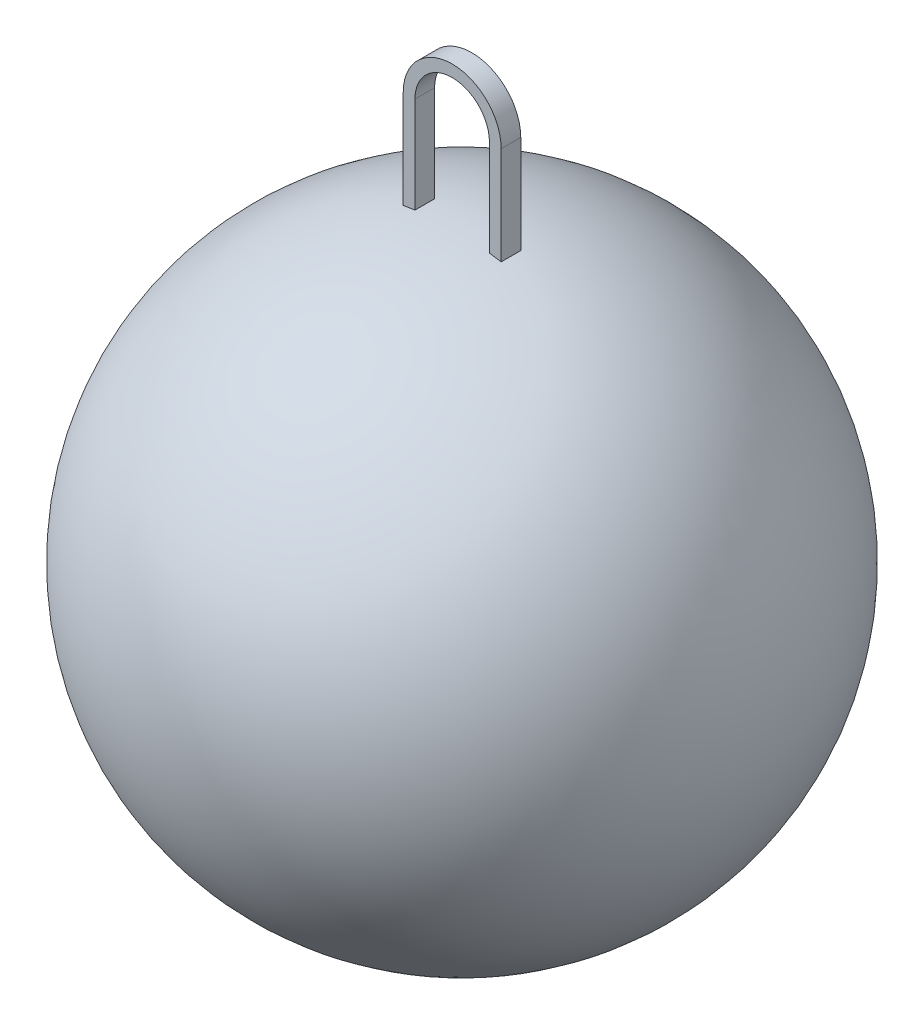
ISO-10303-21;
HEADER;
FILE_DESCRIPTION(('STEP AP214'),'2;1');
FILE_NAME('part.step','',(''),(''),'','','');
FILE_SCHEMA(('AUTOMOTIVE_DESIGN { 1 0 10303 214 1 1 1 1 }'));
ENDSEC;
DATA;
#1=APPLICATION_CONTEXT('core data for automotive mechanical design processes');
#2=APPLICATION_PROTOCOL_DEFINITION('international standard','automotive_design',2000,#1);
#3=PRODUCT_CONTEXT('',#1,'mechanical');
#4=PRODUCT('Part','Part','',(#3));
#5=PRODUCT_RELATED_PRODUCT_CATEGORY('part','',(#4));
#6=PRODUCT_DEFINITION_FORMATION('','',#4);
#7=PRODUCT_DEFINITION_CONTEXT('part definition',#1,'design');
#8=PRODUCT_DEFINITION('design','',#6,#7);
#9=PRODUCT_DEFINITION_SHAPE('','',#8);
#10=(LENGTH_UNIT() NAMED_UNIT(*) SI_UNIT(.MILLI.,.METRE.));
#11=(NAMED_UNIT(*) PLANE_ANGLE_UNIT() SI_UNIT($,.RADIAN.));
#12=(NAMED_UNIT(*) SI_UNIT($,.STERADIAN.) SOLID_ANGLE_UNIT());
#13=UNCERTAINTY_MEASURE_WITH_UNIT(LENGTH_MEASURE(1.E-05),#10,'distance_accuracy_value','');
#14=(GEOMETRIC_REPRESENTATION_CONTEXT(3) GLOBAL_UNCERTAINTY_ASSIGNED_CONTEXT((#13)) GLOBAL_UNIT_ASSIGNED_CONTEXT((#10,
#11,#12)) REPRESENTATION_CONTEXT('',''));
#15=CARTESIAN_POINT('',(0.,0.,0.));
#16=DIRECTION('',(0.,0.,1.));
#17=DIRECTION('',(1.,0.,0.));
#18=AXIS2_PLACEMENT_3D('',#15,#16,#17);
#19=CARTESIAN_POINT('',(-3.175,18.7835533113413,0.635));
#20=CARTESIAN_POINT('',(-2.92133611702739,18.8230332442055,0.635));
#21=CARTESIAN_POINT('',(-2.66767223405477,18.8625131770697,0.635));
#22=CARTESIAN_POINT('',(-2.413,18.8965587078706,0.635));
#23=B_SPLINE_CURVE_WITH_KNOTS('',3,(#19,#20,#21,#22),.UNSPECIFIED.,.F.,.F.,(4,4),(0.,
0.120994824304114),.UNSPECIFIED.);
#24=DIRECTION('',(0.,0.,-1.));
#25=VECTOR('',#24,1.);
#26=SURFACE_OF_LINEAR_EXTRUSION('',#23,#25);
#27=CARTESIAN_POINT('',(-2.41300000000109,18.8965587078705,0.));
#28=CARTESIAN_POINT('',(-2.41300225935658,18.8965584131608,0.00758621273263677));
#29=CARTESIAN_POINT('',(-2.41377594278544,18.8964550287992,0.015180129458778));
#30=CARTESIAN_POINT('',(-2.41674835483196,18.8960572693409,0.0300880405623465));
#31=CARTESIAN_POINT('',(-2.41895191229573,18.8957622470578,0.0374009971375519));
#32=CARTESIAN_POINT('',(-2.4252752248861,18.8949137678169,0.0535623382007448));
#33=CARTESIAN_POINT('',(-2.42976016315263,18.8943108866481,0.0622619612287402));
#34=CARTESIAN_POINT('',(-2.44000444707159,18.8929287579919,0.0788503413893238));
#35=CARTESIAN_POINT('',(-2.44576673825889,18.8921491027729,0.0867371616259188));
#36=CARTESIAN_POINT('',(-2.46336550522641,18.8897580774917,0.108142235592296));
#37=CARTESIAN_POINT('',(-2.47622273802365,18.8880002713748,0.120792898701981));
#38=CARTESIAN_POINT('',(-2.50349402780998,18.8842406488699,0.144229379997704));
#39=CARTESIAN_POINT('',(-2.51791298923985,18.8822380610831,0.155009029493356));
#40=CARTESIAN_POINT('',(-2.54704810293762,18.8781586595491,0.174550422004346));
#41=CARTESIAN_POINT('',(-2.56171771551157,18.8760898724758,0.183383628535904));
#42=CARTESIAN_POINT('',(-2.59172813363006,18.8718263435699,0.199783736617184));
#43=CARTESIAN_POINT('',(-2.60706925853147,18.8696315416493,0.207350027210954));
#44=CARTESIAN_POINT('',(-2.6539001097706,18.8628845173785,0.228226971180323));
#45=CARTESIAN_POINT('',(-2.68620541788548,18.8581685432107,0.239720933171057));
#46=CARTESIAN_POINT('',(-2.74672473744858,18.8492270771831,0.255876683275331));
#47=CARTESIAN_POINT('',(-2.7747312087992,18.8450495496567,0.261354281572628));
#48=CARTESIAN_POINT('',(-2.83128094542696,18.8365454475578,0.267820745508238));
#49=CARTESIAN_POINT('',(-2.85982372133725,18.8322190061274,0.268813521055984));
#50=CARTESIAN_POINT('',(-2.90785295823394,18.8248941224522,0.265801748199511));
#51=CARTESIAN_POINT('',(-2.92742813493473,18.8218959738747,0.263238558279206));
#52=CARTESIAN_POINT('',(-2.96592898601338,18.815980062111,0.255056101429565));
#53=CARTESIAN_POINT('',(-2.98485607567707,18.8130621269261,0.249444014255571));
#54=CARTESIAN_POINT('',(-3.01817095384053,18.807914503278,0.236144379920171));
#55=CARTESIAN_POINT('',(-3.03276930257947,18.8056543998544,0.228999877270903));
#56=CARTESIAN_POINT('',(-3.06058098582347,18.8013432509693,0.212372937332656));
#57=CARTESIAN_POINT('',(-3.07379708361877,18.7992917886442,0.202895296687205));
#58=CARTESIAN_POINT('',(-3.09843237833966,18.7954650021005,0.181611305000575));
#59=CARTESIAN_POINT('',(-3.10983796777014,18.7936917700685,0.169788695460442));
#60=CARTESIAN_POINT('',(-3.13021750651366,18.7905222672559,0.144158552552919));
#61=CARTESIAN_POINT('',(-3.13919233115835,18.7891258607791,0.130351736457849));
#62=CARTESIAN_POINT('',(-3.15345363183424,18.7869066756521,0.102862873766282));
#63=CARTESIAN_POINT('',(-3.15904072927538,18.7860371506432,0.0893402342956983));
#64=CARTESIAN_POINT('',(-3.16780015832591,18.7846738882378,0.0615120835337005));
#65=CARTESIAN_POINT('',(-3.17096971752393,18.7841805822861,0.0472056935269195));
#66=CARTESIAN_POINT('',(-3.17649005897765,18.7833213947562,0.00496288685661327));
#67=CARTESIAN_POINT('',(-3.17545919565654,18.7834818197878,-0.0235073920290209));
#68=CARTESIAN_POINT('',(-3.16412226799843,18.7852463273268,-0.0783368830550214));
#69=CARTESIAN_POINT('',(-3.15384571878601,18.7868458158931,-0.104702522472787));
#70=CARTESIAN_POINT('',(-3.12529474049448,18.7912881696878,-0.152671259907169));
#71=CARTESIAN_POINT('',(-3.10698395368843,18.7941366871689,-0.174252028512956));
#72=CARTESIAN_POINT('',(-3.06391971342457,18.8008260464569,-0.211398508481717));
#73=CARTESIAN_POINT('',(-3.03893356843983,18.8047026811881,-0.226682391459553));
#74=CARTESIAN_POINT('',(-2.99404481339618,18.8116439550302,-0.246300268647158));
#75=CARTESIAN_POINT('',(-2.974899315442,18.8145981884739,-0.252549461165349));
#76=CARTESIAN_POINT('',(-2.93584093594336,18.8206055352154,-0.261834009974661));
#77=CARTESIAN_POINT('',(-2.91592688306656,18.8236587982124,-0.264864242325082));
#78=CARTESIAN_POINT('',(-2.86794595566854,18.8309842760192,-0.268740970870418));
#79=CARTESIAN_POINT('',(-2.83977621137632,18.8352599536902,-0.268245832054244));
#80=CARTESIAN_POINT('',(-2.78384118688098,18.8436853966586,-0.262795285665292));
#81=CARTESIAN_POINT('',(-2.75607726623766,18.8478347742251,-0.25782734401707));
#82=CARTESIAN_POINT('',(-2.69367668601035,18.8570745183662,-0.242233268265167));
#83=CARTESIAN_POINT('',(-2.6593255182676,18.8620977682598,-0.230401532779646));
#84=CARTESIAN_POINT('',(-2.60966513853692,18.8692597281914,-0.208609604833623));
#85=CARTESIAN_POINT('',(-2.59344898173665,18.8715812291214,-0.200688616579001));
#86=CARTESIAN_POINT('',(-2.56174175584871,18.8760870555738,-0.183430543345045));
#87=CARTESIAN_POINT('',(-2.54625098639653,18.8782713245349,-0.17409287981614));
#88=CARTESIAN_POINT('',(-2.52081739816019,18.8818305574969,-0.156896001027237));
#89=CARTESIAN_POINT('',(-2.51060895584372,18.8832511141805,-0.149438684850214));
#90=CARTESIAN_POINT('',(-2.49088952508948,18.8859807401798,-0.133648015364245));
#91=CARTESIAN_POINT('',(-2.4813775442484,18.8872899685768,-0.12531595142726));
#92=CARTESIAN_POINT('',(-2.46323010243629,18.889775301503,-0.107481893031112));
#93=CARTESIAN_POINT('',(-2.45460803622961,18.8909493957957,-0.0979657666578778));
#94=CARTESIAN_POINT('',(-2.43902204338919,18.8930624658659,-0.0776255007316109));
#95=CARTESIAN_POINT('',(-2.43205117298925,18.8940024271351,-0.0668071380675114));
#96=CARTESIAN_POINT('',(-2.42336849268422,18.8951698272596,-0.0489186416968951));
#97=CARTESIAN_POINT('',(-2.42069769632732,18.895528086065,-0.0423283546545368));
#98=CARTESIAN_POINT('',(-2.4164637240451,18.8960954508868,-0.0288041740106734));
#99=CARTESIAN_POINT('',(-2.41489682733899,18.8963050579617,-0.0218715197744595));
#100=CARTESIAN_POINT('',(-2.41332785142045,18.8965148858211,-0.00993238703645786));
#101=CARTESIAN_POINT('',(-2.41299852045799,18.8965589008616,-0.00496784537359225));
#102=CARTESIAN_POINT('',(-2.41300000000109,18.8965587078705,0.));
#103=B_SPLINE_CURVE_WITH_KNOTS('',3,(#27,#28,#29,#30,#31,#32,#33,#34,#35,#36,#37,#38,#39,#40,
#41,#42,#43,#44,#45,#46,#47,#48,#49,#50,#51,#52,#53,#54,#55,#56,#57,#58,#59,#60,#61,#62,#63,#64,
#65,#66,#67,#68,#69,#70,#71,#72,#73,#74,#75,#76,#77,#78,#79,#80,#81,#82,#83,#84,#85,#86,#87,#88,
#89,#90,#91,#92,#93,#94,#95,#96,#97,#98,#99,#100,#101,#102),.UNSPECIFIED.,.T.,.F.,(4,2,2,2,2,2,
2,2,2,2,2,2,2,2,2,2,2,2,2,2,2,2,2,2,2,2,2,2,2,2,2,2,2,2,2,2,2,4),(0.,0.0227360385974058,
0.0455492618052793,0.0747975456526341,0.104113989992991,0.158182877892872,0.212426776550441,
0.264097660147349,0.315793390127081,0.419156003003497,0.505415247332358,0.591599275533002,
0.651310111735127,0.710880942379938,0.759909686295304,0.808838462851685,0.858119149529595,
0.907382066297256,0.951124406737006,0.994916835394072,1.07863906142471,1.16209496453693,
1.24593249384904,1.33319587463737,1.39398836947839,1.45487748946615,1.53990109983458,
1.6251637148605,1.73462195277667,1.78916416826597,1.84372871825989,1.88185735443805,
1.91993055802064,1.95851197067394,1.99692813625433,2.01821322211416,2.0394262171631,
2.05431495389388),.UNSPECIFIED.);
#104=CARTESIAN_POINT('',(-2.413,18.8965587078706,0.));
#105=VERTEX_POINT('',#104);
#106=CARTESIAN_POINT('',(-3.175,18.7835533113413,0.));
#107=VERTEX_POINT('',#106);
#108=EDGE_CURVE('E11',#105,#107,#103,.T.);
#109=ORIENTED_EDGE('',*,*,#108,.F.);
#110=DIRECTION('',(0.,0.,-1.));
#111=VECTOR('',#110,1.);
#112=CARTESIAN_POINT('',(-2.413,18.8965587078706,0.635));
#113=LINE('',#112,#111);
#114=CARTESIAN_POINT('',(-2.413,18.8965587078706,0.635));
#115=VERTEX_POINT('',#114);
#116=EDGE_CURVE('E52',#115,#105,#113,.T.);
#117=ORIENTED_EDGE('',*,*,#116,.F.);
#118=CARTESIAN_POINT('',(-3.175,18.7835533113413,0.635));
#119=VERTEX_POINT('',#118);
#120=EDGE_CURVE('E161',#119,#115,#23,.T.);
#121=ORIENTED_EDGE('',*,*,#120,.F.);
#122=DIRECTION('',(0.,0.,-1.));
#123=VECTOR('',#122,1.);
#124=CARTESIAN_POINT('',(-3.175,18.7835533113413,0.635));
#125=LINE('',#124,#123);
#126=EDGE_CURVE('E210',#119,#107,#125,.T.);
#127=ORIENTED_EDGE('',*,*,#126,.T.);
#128=EDGE_LOOP('',(#109,#117,#121,#127));
#129=FACE_BOUND('',#128,.T.);
#130=ADVANCED_FACE('F34',(#129),#26,.F.);
#131=CARTESIAN_POINT('',(2.413,18.8965587078706,0.635));
#132=CARTESIAN_POINT('',(2.66767223405585,18.8625131770696,0.635));
#133=CARTESIAN_POINT('',(2.92133611702792,18.8230332442054,0.635));
#134=CARTESIAN_POINT('',(3.175,18.7835533113413,0.635));
#135=B_SPLINE_CURVE_WITH_KNOTS('',3,(#131,#132,#133,#134),.UNSPECIFIED.,.F.,.F.,(4,4),
(0.879005175695886,1.),.UNSPECIFIED.);
#136=DIRECTION('',(0.,0.,-1.));
#137=VECTOR('',#136,1.);
#138=SURFACE_OF_LINEAR_EXTRUSION('',#135,#137);
#139=CARTESIAN_POINT('',(3.175,18.7835533113413,0.));
#140=CARTESIAN_POINT('',(3.17500042203024,18.7835532456959,0.0142311248153335));
#141=CARTESIAN_POINT('',(3.17378982221504,18.7837416617209,0.028458861852287));
#142=CARTESIAN_POINT('',(3.16898438009338,18.7844895739767,0.0564954997697923));
#143=CARTESIAN_POINT('',(3.16538986897108,18.7850490186624,0.0703044585503629));
#144=CARTESIAN_POINT('',(3.15592886179341,18.7865214464376,0.0970941379568112));
#145=CARTESIAN_POINT('',(3.15006314892926,18.7874343076566,0.110075142295572));
#146=CARTESIAN_POINT('',(3.13625243766015,18.7895832590845,0.134847572778942));
#147=CARTESIAN_POINT('',(3.12830742304916,18.7908193518126,0.146638989650939));
#148=CARTESIAN_POINT('',(3.11064957788382,18.7935655229363,0.168684861736354));
#149=CARTESIAN_POINT('',(3.100944729144,18.7950743641744,0.178945889974746));
#150=CARTESIAN_POINT('',(3.08005686263172,18.7983196527912,0.197810810618427));
#151=CARTESIAN_POINT('',(3.06887178647797,18.8000564170875,0.206412353665648));
#152=CARTESIAN_POINT('',(3.04456738072483,18.8038262559317,0.22238871584239));
#153=CARTESIAN_POINT('',(3.03136787418192,18.8058715021653,0.229638150970785));
#154=CARTESIAN_POINT('',(3.00406835241466,18.8100947253207,0.24216089206712));
#155=CARTESIAN_POINT('',(2.98996652101188,18.8122729695072,0.24743005578454));
#156=CARTESIAN_POINT('',(2.93273778200041,18.8210929878242,0.264646673801513));
#157=CARTESIAN_POINT('',(2.88736237419356,18.8280428445685,0.26919360923072));
#158=CARTESIAN_POINT('',(2.81053281171484,18.8396785289377,0.266442414666032));
#159=CARTESIAN_POINT('',(2.77880471918458,18.8444439652508,0.262156985594865));
#160=CARTESIAN_POINT('',(2.71637202343286,18.8537274944694,0.248627914659464));
#161=CARTESIAN_POINT('',(2.68566723558529,18.8582456320885,0.23938517240115));
#162=CARTESIAN_POINT('',(2.62477326485118,18.8670999472487,0.216162923531506));
#163=CARTESIAN_POINT('',(2.59464239593116,18.8714237263899,0.20202493356003));
#164=CARTESIAN_POINT('',(2.55145758331364,18.8775378150229,0.177231226452438));
#165=CARTESIAN_POINT('',(2.53739176446846,18.879514755191,0.168363864454287));
#166=CARTESIAN_POINT('',(2.51020225245235,18.883309665958,0.149262316984241));
#167=CARTESIAN_POINT('',(2.49707726382994,18.885127855927,0.139030068680845));
#168=CARTESIAN_POINT('',(2.47301390927125,18.8884389239155,0.117577374811218));
#169=CARTESIAN_POINT('',(2.46199110864478,18.8899448608353,0.106454860732322));
#170=CARTESIAN_POINT('',(2.44217189248914,18.8926374577347,0.0823801723997724));
#171=CARTESIAN_POINT('',(2.43335443003729,18.8938271433636,0.069447289784682));
#172=CARTESIAN_POINT('',(2.42351929297062,18.8951495783915,0.0492488351206674));
#173=CARTESIAN_POINT('',(2.42088333233714,18.8955031908815,0.0427977468936915));
#174=CARTESIAN_POINT('',(2.41666253685157,18.8960688270525,0.0295512487308082));
#175=CARTESIAN_POINT('',(2.41507654390758,18.8962810067328,0.0227562270843825));
#176=CARTESIAN_POINT('',(2.4131410068864,18.8965398882658,0.0089310328175413));
#177=CARTESIAN_POINT('',(2.41280073954635,18.8965853485881,0.00189948789179688));
#178=CARTESIAN_POINT('',(2.41342927520172,18.896501317169,-0.0121033871207011));
#179=CARTESIAN_POINT('',(2.41439869547724,18.8963717429305,-0.0190746872540936));
#180=CARTESIAN_POINT('',(2.41948813687979,18.8956904928178,-0.0413019481451675));
#181=CARTESIAN_POINT('',(2.42603426171044,18.8948133023836,-0.0559884922173103));
#182=CARTESIAN_POINT('',(2.44102392544708,18.8927914188665,-0.0806861953566241));
#183=CARTESIAN_POINT('',(2.448946583905,18.8917188056675,-0.0910669547946526));
#184=CARTESIAN_POINT('',(2.46617585333024,18.8893728796613,-0.110632042353586));
#185=CARTESIAN_POINT('',(2.47548683089222,18.8880989328258,-0.119812417523884));
#186=CARTESIAN_POINT('',(2.49512626319155,18.8853960107299,-0.13725813271207));
#187=CARTESIAN_POINT('',(2.50546727339616,18.8839650933501,-0.145508651889869));
#188=CARTESIAN_POINT('',(2.52678928024381,18.8809971657596,-0.161117422228229));
#189=CARTESIAN_POINT('',(2.53777064108714,18.8794600950805,-0.168475158142253));
#190=CARTESIAN_POINT('',(2.57145794986659,18.8747171919468,-0.189376213643143));
#191=CARTESIAN_POINT('',(2.59488738252243,18.8713823784074,-0.201730939992785));
#192=CARTESIAN_POINT('',(2.64576214514521,18.8640610390083,-0.224780648484503));
#193=CARTESIAN_POINT('',(2.6733602093751,18.8600436057161,-0.235123881852592));
#194=CARTESIAN_POINT('',(2.72968463519538,18.8517566591543,-0.251935882838379));
#195=CARTESIAN_POINT('',(2.7584102774463,18.8474873057497,-0.258407079157809));
#196=CARTESIAN_POINT('',(2.8111958318303,18.8395731288244,-0.265990343876538));
#197=CARTESIAN_POINT('',(2.83514836033422,18.8359568674583,-0.267866019106299));
#198=CARTESIAN_POINT('',(2.88307053693223,18.8286800676507,-0.267948495140787));
#199=CARTESIAN_POINT('',(2.90704013127846,18.8250195866314,-0.26615963231108));
#200=CARTESIAN_POINT('',(2.94880544899853,18.8186141721742,-0.259141234950165));
#201=CARTESIAN_POINT('',(2.96674620427796,18.815853405079,-0.254803768327415));
#202=CARTESIAN_POINT('',(3.00169102156905,18.8104630162517,-0.243262143365771));
#203=CARTESIAN_POINT('',(3.01869698537044,18.8078331293668,-0.236064070621159));
#204=CARTESIAN_POINT('',(3.0484853702449,18.8032191569337,-0.220064455852275));
#205=CARTESIAN_POINT('',(3.06150439792375,18.8011996791372,-0.211715523140444));
#206=CARTESIAN_POINT('',(3.08596924042555,18.7974015489169,-0.192949234362053));
#207=CARTESIAN_POINT('',(3.09741819129112,18.795622416541,-0.182536106166717));
#208=CARTESIAN_POINT('',(3.11837608346457,18.7923641523285,-0.15976089745972));
#209=CARTESIAN_POINT('',(3.12787463648703,18.7908866271572,-0.147388972320151));
#210=CARTESIAN_POINT('',(3.14446511411964,18.7883054550231,-0.121081703075502));
#211=CARTESIAN_POINT('',(3.1515565069731,18.7872018906706,-0.107146014428805));
#212=CARTESIAN_POINT('',(3.16312113437716,18.7854021203949,-0.0779867930905041));
#213=CARTESIAN_POINT('',(3.16755852159076,18.7847114919855,-0.0627486719514285));
#214=CARTESIAN_POINT('',(3.1734998150539,18.783786797848,-0.0316728516965731));
#215=CARTESIAN_POINT('',(3.17499953042604,18.783553384382,-0.0158343288124154));
#216=CARTESIAN_POINT('',(3.175,18.7835533113413,0.));
#217=B_SPLINE_CURVE_WITH_KNOTS('',3,(#139,#140,#141,#142,#143,#144,#145,#146,#147,#148,#149,
#150,#151,#152,#153,#154,#155,#156,#157,#158,#159,#160,#161,#162,#163,#164,#165,#166,#167,#168,
#169,#170,#171,#172,#173,#174,#175,#176,#177,#178,#179,#180,#181,#182,#183,#184,#185,#186,#187,
#188,#189,#190,#191,#192,#193,#194,#195,#196,#197,#198,#199,#200,#201,#202,#203,#204,#205,#206,
#207,#208,#209,#210,#211,#212,#213,#214,#215,#216),.UNSPECIFIED.,.T.,.F.,(4,2,2,2,2,2,2,2,2,2,2,
2,2,2,2,2,2,2,2,2,2,2,2,2,2,2,2,2,2,2,2,2,2,2,2,2,2,2,4),(0.,0.0426352443954405,
0.0852645669429324,0.127879202455333,0.170494170115187,0.212920481676773,0.255406423009345,
0.300820163396737,0.346328376540089,0.481834675257875,0.578631117789565,0.675410000566354,
0.775671459764034,0.825849320475541,0.875956707355377,0.923017022968893,0.969609424299315,
0.990471254539201,1.01131003611887,1.03230368899991,1.05330724003212,1.10063988021214,
1.13982144585657,1.17912895312626,1.21899383153737,1.25888160858442,1.33873391726945,
1.42772459187171,1.51665938916961,1.58933100073698,1.66191666732879,1.7177041384842,
1.77337355844304,1.81996888796287,1.86646974938749,1.91321220426963,1.95996497814189,
2.00733575591061,2.05477406367022),.UNSPECIFIED.);
#218=CARTESIAN_POINT('',(3.175,18.7835533113413,0.));
#219=VERTEX_POINT('',#218);
#220=CARTESIAN_POINT('',(2.413,18.8965587078706,0.));
#221=VERTEX_POINT('',#220);
#222=EDGE_CURVE('E232',#219,#221,#217,.T.);
#223=ORIENTED_EDGE('',*,*,#222,.F.);
#224=DIRECTION('',(0.,0.,-1.));
#225=VECTOR('',#224,1.);
#226=CARTESIAN_POINT('',(3.175,18.7835533113413,0.635));
#227=LINE('',#226,#225);
#228=CARTESIAN_POINT('',(3.175,18.7835533113413,0.635));
#229=VERTEX_POINT('',#228);
#230=EDGE_CURVE('E60',#229,#219,#227,.T.);
#231=ORIENTED_EDGE('',*,*,#230,.F.);
#232=CARTESIAN_POINT('',(2.413,18.8965587078706,0.635));
#233=VERTEX_POINT('',#232);
#234=EDGE_CURVE('E194',#233,#229,#135,.T.);
#235=ORIENTED_EDGE('',*,*,#234,.F.);
#236=DIRECTION('',(0.,0.,-1.));
#237=VECTOR('',#236,1.);
#238=CARTESIAN_POINT('',(2.413,18.8965587078706,0.635));
#239=LINE('',#238,#237);
#240=EDGE_CURVE('E222',#233,#221,#239,.T.);
#241=ORIENTED_EDGE('',*,*,#240,.T.);
#242=EDGE_LOOP('',(#223,#231,#235,#241));
#243=FACE_BOUND('',#242,.T.);
#244=ADVANCED_FACE('F175',(#243),#138,.F.);
#245=EDGE_CURVE('E39',#107,#105,#103,.T.);
#246=ORIENTED_EDGE('',*,*,#245,.F.);
#247=CARTESIAN_POINT('',(-3.175,18.7835533113413,-0.635));
#248=VERTEX_POINT('',#247);
#249=EDGE_CURVE('E134',#107,#248,#125,.T.);
#250=ORIENTED_EDGE('',*,*,#249,.T.);
#251=CARTESIAN_POINT('',(-3.175,18.7835533113413,-0.635));
#252=CARTESIAN_POINT('',(-2.92133611702739,18.8230332442055,-0.635));
#253=CARTESIAN_POINT('',(-2.66767223405477,18.8625131770697,-0.635));
#254=CARTESIAN_POINT('',(-2.413,18.8965587078706,-0.635));
#255=B_SPLINE_CURVE_WITH_KNOTS('',3,(#251,#252,#253,#254),.UNSPECIFIED.,.F.,.F.,(4,4),(0.,
0.120994824304114),.UNSPECIFIED.);
#256=CARTESIAN_POINT('',(-2.413,18.8965587078706,-0.635));
#257=VERTEX_POINT('',#256);
#258=EDGE_CURVE('E128',#248,#257,#255,.T.);
#259=ORIENTED_EDGE('',*,*,#258,.T.);
#260=EDGE_CURVE('E112',#105,#257,#113,.T.);
#261=ORIENTED_EDGE('',*,*,#260,.F.);
#262=EDGE_LOOP('',(#246,#250,#259,#261));
#263=FACE_BOUND('',#262,.T.);
#264=ADVANCED_FACE('F132',(#263),#26,.F.);
#265=CARTESIAN_POINT('',(-2.413,25.1335533113413,0.635));
#266=DIRECTION('',(-1.,0.,0.));
#267=DIRECTION('',(0.,0.,1.));
#268=AXIS2_PLACEMENT_3D('',#265,#266,#267);
#269=PLANE('',#268);
#270=DIRECTION('',(0.,1.,0.));
#271=VECTOR('',#270,1.);
#272=CARTESIAN_POINT('',(-2.413,25.1335533113413,-0.635));
#273=LINE('',#272,#271);
#274=CARTESIAN_POINT('',(-2.413,25.1335533113413,-0.635));
#275=VERTEX_POINT('',#274);
#276=EDGE_CURVE('E116',#257,#275,#273,.T.);
#277=ORIENTED_EDGE('',*,*,#276,.T.);
#278=DIRECTION('',(0.,0.,-1.));
#279=VECTOR('',#278,1.);
#280=CARTESIAN_POINT('',(-2.413,25.1335533113413,0.635));
#281=LINE('',#280,#279);
#282=CARTESIAN_POINT('',(-2.413,25.1335533113413,0.635));
#283=VERTEX_POINT('',#282);
#284=EDGE_CURVE('E121',#283,#275,#281,.T.);
#285=ORIENTED_EDGE('',*,*,#284,.F.);
#286=DIRECTION('',(0.,1.,0.));
#287=VECTOR('',#286,1.);
#288=CARTESIAN_POINT('',(-2.413,18.8965587078706,0.635));
#289=LINE('',#288,#287);
#290=EDGE_CURVE('E167',#115,#283,#289,.T.);
#291=ORIENTED_EDGE('',*,*,#290,.F.);
#292=ORIENTED_EDGE('',*,*,#116,.T.);
#293=ORIENTED_EDGE('',*,*,#260,.T.);
#294=EDGE_LOOP('',(#277,#285,#291,#292,#293));
#295=FACE_BOUND('',#294,.T.);
#296=ADVANCED_FACE('F114',(#295),#269,.F.);
#297=CARTESIAN_POINT('',(0.,25.1335533113413,0.635));
#298=DIRECTION('',(0.,0.,-1.));
#299=DIRECTION('',(-1.,0.,0.));
#300=AXIS2_PLACEMENT_3D('',#297,#298,#299);
#301=CYLINDRICAL_SURFACE('',#300,2.413);
#302=CARTESIAN_POINT('',(0.,25.1335533113413,-0.635));
#303=DIRECTION('',(0.,0.,-1.));
#304=DIRECTION('',(1.,0.,0.));
#305=AXIS2_PLACEMENT_3D('',#302,#303,#304);
#306=CIRCLE('',#305,2.413);
#307=CARTESIAN_POINT('',(2.413,25.1335533113413,-0.635));
#308=VERTEX_POINT('',#307);
#309=EDGE_CURVE('E130',#275,#308,#306,.T.);
#310=ORIENTED_EDGE('',*,*,#309,.T.);
#311=DIRECTION('',(0.,0.,-1.));
#312=VECTOR('',#311,1.);
#313=CARTESIAN_POINT('',(2.413,25.1335533113413,0.635));
#314=LINE('',#313,#312);
#315=CARTESIAN_POINT('',(2.413,25.1335533113413,0.635));
#316=VERTEX_POINT('',#315);
#317=EDGE_CURVE('E225',#316,#308,#314,.T.);
#318=ORIENTED_EDGE('',*,*,#317,.F.);
#319=CARTESIAN_POINT('',(0.,25.1335533113413,0.635));
#320=DIRECTION('',(0.,0.,-1.));
#321=DIRECTION('',(1.,0.,0.));
#322=AXIS2_PLACEMENT_3D('',#319,#320,#321);
#323=CIRCLE('',#322,2.413);
#324=EDGE_CURVE('E260',#283,#316,#323,.T.);
#325=ORIENTED_EDGE('',*,*,#324,.F.);
#326=ORIENTED_EDGE('',*,*,#284,.T.);
#327=EDGE_LOOP('',(#310,#318,#325,#326));
#328=FACE_BOUND('',#327,.T.);
#329=ADVANCED_FACE('F178',(#328),#301,.F.);
#330=CARTESIAN_POINT('',(2.413,18.8965587078706,0.635));
#331=DIRECTION('',(1.,0.,0.));
#332=DIRECTION('',(0.,0.,-1.));
#333=AXIS2_PLACEMENT_3D('',#330,#331,#332);
#334=PLANE('',#333);
#335=DIRECTION('',(0.,-1.,0.));
#336=VECTOR('',#335,1.);
#337=CARTESIAN_POINT('',(2.413,18.8965587078706,-0.635));
#338=LINE('',#337,#336);
#339=CARTESIAN_POINT('',(2.413,18.8965587078706,-0.635));
#340=VERTEX_POINT('',#339);
#341=EDGE_CURVE('E144',#308,#340,#338,.T.);
#342=ORIENTED_EDGE('',*,*,#341,.T.);
#343=EDGE_CURVE('E221',#221,#340,#239,.T.);
#344=ORIENTED_EDGE('',*,*,#343,.F.);
#345=ORIENTED_EDGE('',*,*,#240,.F.);
#346=DIRECTION('',(0.,-1.,0.));
#347=VECTOR('',#346,1.);
#348=CARTESIAN_POINT('',(2.413,25.1335533113413,0.635));
#349=LINE('',#348,#347);
#350=EDGE_CURVE('E201',#316,#233,#349,.T.);
#351=ORIENTED_EDGE('',*,*,#350,.F.);
#352=ORIENTED_EDGE('',*,*,#317,.T.);
#353=EDGE_LOOP('',(#342,#344,#345,#351,#352));
#354=FACE_BOUND('',#353,.T.);
#355=ADVANCED_FACE('F181',(#354),#334,.F.);
#356=EDGE_CURVE('E228',#221,#219,#217,.T.);
#357=ORIENTED_EDGE('',*,*,#356,.F.);
#358=ORIENTED_EDGE('',*,*,#343,.T.);
#359=CARTESIAN_POINT('',(2.413,18.8965587078706,-0.635));
#360=CARTESIAN_POINT('',(2.66767223405585,18.8625131770696,-0.635));
#361=CARTESIAN_POINT('',(2.92133611702792,18.8230332442054,-0.635));
#362=CARTESIAN_POINT('',(3.175,18.7835533113413,-0.635));
#363=B_SPLINE_CURVE_WITH_KNOTS('',3,(#359,#360,#361,#362),.UNSPECIFIED.,.F.,.F.,(4,4),
(0.879005175695886,1.),.UNSPECIFIED.);
#364=CARTESIAN_POINT('',(3.175,18.7835533113413,-0.635));
#365=VERTEX_POINT('',#364);
#366=EDGE_CURVE('E147',#340,#365,#363,.T.);
#367=ORIENTED_EDGE('',*,*,#366,.T.);
#368=EDGE_CURVE('E219',#219,#365,#227,.T.);
#369=ORIENTED_EDGE('',*,*,#368,.F.);
#370=EDGE_LOOP('',(#357,#358,#367,#369));
#371=FACE_BOUND('',#370,.T.);
#372=ADVANCED_FACE('F185',(#371),#138,.F.);
#373=CARTESIAN_POINT('',(3.175,25.1335533113413,0.635));
#374=DIRECTION('',(-1.,0.,0.));
#375=DIRECTION('',(0.,-1.,0.));
#376=AXIS2_PLACEMENT_3D('',#373,#374,#375);
#377=PLANE('',#376);
#378=DIRECTION('',(0.,1.,0.));
#379=VECTOR('',#378,1.);
#380=CARTESIAN_POINT('',(3.175,25.1335533113413,-0.635));
#381=LINE('',#380,#379);
#382=CARTESIAN_POINT('',(3.175,25.1335533113413,-0.635));
#383=VERTEX_POINT('',#382);
#384=EDGE_CURVE('E152',#365,#383,#381,.T.);
#385=ORIENTED_EDGE('',*,*,#384,.T.);
#386=DIRECTION('',(0.,0.,-1.));
#387=VECTOR('',#386,1.);
#388=CARTESIAN_POINT('',(3.175,25.1335533113413,0.635));
#389=LINE('',#388,#387);
#390=CARTESIAN_POINT('',(3.175,25.1335533113413,0.635));
#391=VERTEX_POINT('',#390);
#392=EDGE_CURVE('E216',#391,#383,#389,.T.);
#393=ORIENTED_EDGE('',*,*,#392,.F.);
#394=DIRECTION('',(0.,1.,0.));
#395=VECTOR('',#394,1.);
#396=CARTESIAN_POINT('',(3.175,25.1335533113413,0.635));
#397=LINE('',#396,#395);
#398=EDGE_CURVE('E200',#229,#391,#397,.T.);
#399=ORIENTED_EDGE('',*,*,#398,.F.);
#400=ORIENTED_EDGE('',*,*,#230,.T.);
#401=ORIENTED_EDGE('',*,*,#368,.T.);
#402=EDGE_LOOP('',(#385,#393,#399,#400,#401));
#403=FACE_BOUND('',#402,.T.);
#404=ADVANCED_FACE('F191',(#403),#377,.F.);
#405=CARTESIAN_POINT('',(0.,25.1335533113413,0.635));
#406=DIRECTION('',(0.,0.,-1.));
#407=DIRECTION('',(-1.,0.,0.));
#408=AXIS2_PLACEMENT_3D('',#405,#406,#407);
#409=CYLINDRICAL_SURFACE('',#408,3.175);
#410=CARTESIAN_POINT('',(0.,25.1335533113413,-0.635));
#411=DIRECTION('',(0.,0.,1.));
#412=DIRECTION('',(1.,0.,0.));
#413=AXIS2_PLACEMENT_3D('',#410,#411,#412);
#414=CIRCLE('',#413,3.175);
#415=CARTESIAN_POINT('',(-3.175,25.1335533113413,-0.635));
#416=VERTEX_POINT('',#415);
#417=EDGE_CURVE('E157',#383,#416,#414,.T.);
#418=ORIENTED_EDGE('',*,*,#417,.T.);
#419=DIRECTION('',(0.,0.,-1.));
#420=VECTOR('',#419,1.);
#421=CARTESIAN_POINT('',(-3.175,25.1335533113413,0.635));
#422=LINE('',#421,#420);
#423=CARTESIAN_POINT('',(-3.175,25.1335533113413,0.635));
#424=VERTEX_POINT('',#423);
#425=EDGE_CURVE('E213',#424,#416,#422,.T.);
#426=ORIENTED_EDGE('',*,*,#425,.F.);
#427=CARTESIAN_POINT('',(0.,25.1335533113413,0.635));
#428=DIRECTION('',(0.,0.,1.));
#429=DIRECTION('',(1.,0.,0.));
#430=AXIS2_PLACEMENT_3D('',#427,#428,#429);
#431=CIRCLE('',#430,3.175);
#432=EDGE_CURVE('E206',#391,#424,#431,.T.);
#433=ORIENTED_EDGE('',*,*,#432,.F.);
#434=ORIENTED_EDGE('',*,*,#392,.T.);
#435=EDGE_LOOP('',(#418,#426,#433,#434));
#436=FACE_BOUND('',#435,.T.);
#437=ADVANCED_FACE('F252',(#436),#409,.T.);
#438=CARTESIAN_POINT('',(-3.175,25.1335533113413,0.635));
#439=DIRECTION('',(1.,0.,0.));
#440=DIRECTION('',(0.,1.,0.));
#441=AXIS2_PLACEMENT_3D('',#438,#439,#440);
#442=PLANE('',#441);
#443=DIRECTION('',(0.,-1.,0.));
#444=VECTOR('',#443,1.);
#445=CARTESIAN_POINT('',(-3.175,25.1335533113413,-0.635));
#446=LINE('',#445,#444);
#447=EDGE_CURVE('E159',#416,#248,#446,.T.);
#448=ORIENTED_EDGE('',*,*,#447,.T.);
#449=ORIENTED_EDGE('',*,*,#249,.F.);
#450=ORIENTED_EDGE('',*,*,#126,.F.);
#451=DIRECTION('',(0.,-1.,0.));
#452=VECTOR('',#451,1.);
#453=CARTESIAN_POINT('',(-3.175,25.1335533113413,0.635));
#454=LINE('',#453,#452);
#455=EDGE_CURVE('E208',#424,#119,#454,.T.);
#456=ORIENTED_EDGE('',*,*,#455,.F.);
#457=ORIENTED_EDGE('',*,*,#425,.T.);
#458=EDGE_LOOP('',(#448,#449,#450,#456,#457));
#459=FACE_BOUND('',#458,.T.);
#460=ADVANCED_FACE('F240',(#459),#442,.F.);
#461=CARTESIAN_POINT('',(-2.79437813165581,18.8420939103797,0.635));
#462=DIRECTION('',(0.,0.,1.));
#463=DIRECTION('',(1.,0.,0.));
#464=AXIS2_PLACEMENT_3D('',#461,#462,#463);
#465=PLANE('',#464);
#466=ORIENTED_EDGE('',*,*,#120,.T.);
#467=ORIENTED_EDGE('',*,*,#290,.T.);
#468=ORIENTED_EDGE('',*,*,#324,.T.);
#469=ORIENTED_EDGE('',*,*,#350,.T.);
#470=ORIENTED_EDGE('',*,*,#234,.T.);
#471=ORIENTED_EDGE('',*,*,#398,.T.);
#472=ORIENTED_EDGE('',*,*,#432,.T.);
#473=ORIENTED_EDGE('',*,*,#455,.T.);
#474=EDGE_LOOP('',(#466,#467,#468,#469,#470,#471,#472,#473));
#475=FACE_BOUND('',#474,.T.);
#476=ADVANCED_FACE('F245',(#475),#465,.T.);
#477=CARTESIAN_POINT('',(-2.79437813165581,18.8420939103797,-0.635));
#478=DIRECTION('',(0.,0.,1.));
#479=DIRECTION('',(1.,0.,0.));
#480=AXIS2_PLACEMENT_3D('',#477,#478,#479);
#481=PLANE('',#480);
#482=ORIENTED_EDGE('',*,*,#258,.F.);
#483=ORIENTED_EDGE('',*,*,#447,.F.);
#484=ORIENTED_EDGE('',*,*,#417,.F.);
#485=ORIENTED_EDGE('',*,*,#384,.F.);
#486=ORIENTED_EDGE('',*,*,#366,.F.);
#487=ORIENTED_EDGE('',*,*,#341,.F.);
#488=ORIENTED_EDGE('',*,*,#309,.F.);
#489=ORIENTED_EDGE('',*,*,#276,.F.);
#490=EDGE_LOOP('',(#482,#483,#484,#485,#486,#487,#488,#489));
#491=FACE_BOUND('',#490,.T.);
#492=ADVANCED_FACE('F126',(#491),#481,.F.);
#493=CARTESIAN_POINT('',(0.,0.,0.));
#494=DIRECTION('',(0.,-1.,0.));
#495=DIRECTION('',(-1.,0.,0.));
#496=AXIS2_PLACEMENT_3D('',#493,#494,#495);
#497=SPHERICAL_SURFACE('',#496,19.05);
#498=ORIENTED_EDGE('',*,*,#356,.T.);
#499=ORIENTED_EDGE('',*,*,#222,.T.);
#500=EDGE_LOOP('',(#498,#499));
#501=FACE_BOUND('',#500,.T.);
#502=ORIENTED_EDGE('',*,*,#245,.T.);
#503=ORIENTED_EDGE('',*,*,#108,.T.);
#504=EDGE_LOOP('',(#502,#503));
#505=FACE_BOUND('',#504,.T.);
#506=ADVANCED_FACE('F36',(#501,#505),#497,.T.);
#507=CLOSED_SHELL('',(#130,#244,#264,#296,#329,#355,#372,#404,#437,#460,#476,#492,#506));
#508=MANIFOLD_SOLID_BREP('B2',#507);
#509=ADVANCED_BREP_SHAPE_REPRESENTATION('',(#18,#508),#14);
#510=SHAPE_DEFINITION_REPRESENTATION(#9,#509);
ENDSEC;
END-ISO-10303-21;
